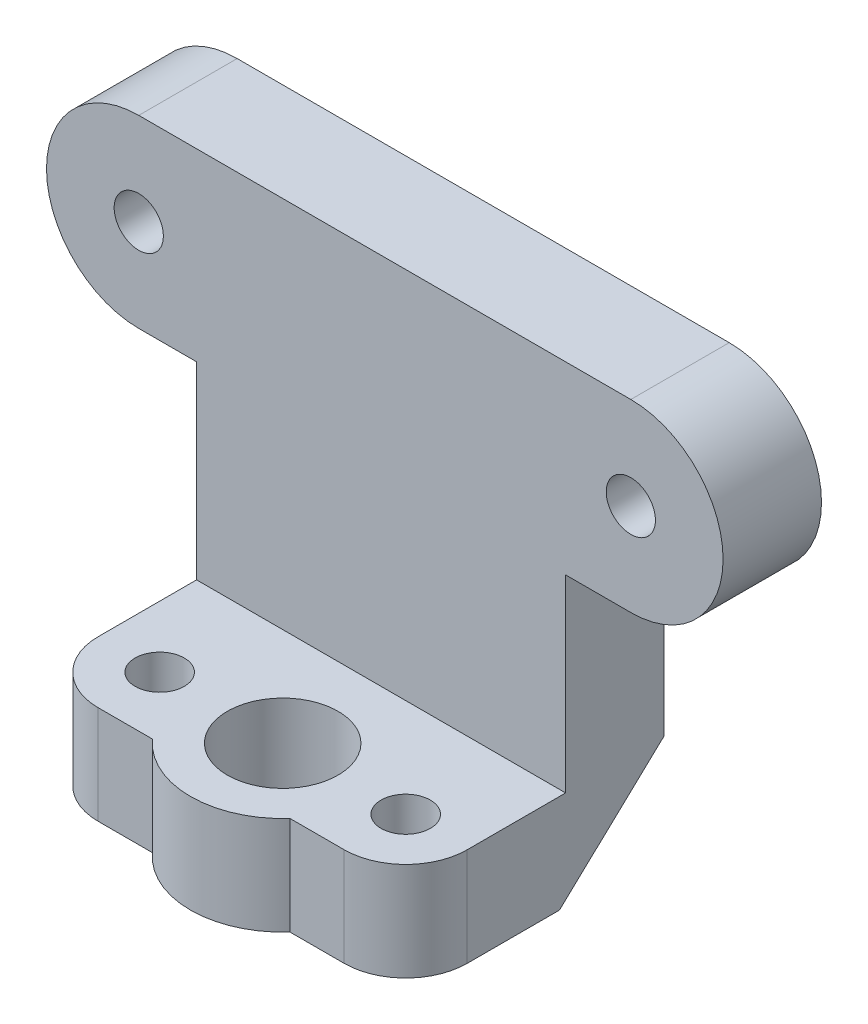
ISO-10303-21;
HEADER;
FILE_DESCRIPTION(('STEP AP214'),'2;1');
FILE_NAME('part.step','',(''),(''),'','','');
FILE_SCHEMA(('AUTOMOTIVE_DESIGN { 1 0 10303 214 1 1 1 1 }'));
ENDSEC;
DATA;
#1=APPLICATION_CONTEXT('core data for automotive mechanical design processes');
#2=APPLICATION_PROTOCOL_DEFINITION('international standard','automotive_design',2000,#1);
#3=PRODUCT_CONTEXT('',#1,'mechanical');
#4=PRODUCT('Part','Part','',(#3));
#5=PRODUCT_RELATED_PRODUCT_CATEGORY('part','',(#4));
#6=PRODUCT_DEFINITION_FORMATION('','',#4);
#7=PRODUCT_DEFINITION_CONTEXT('part definition',#1,'design');
#8=PRODUCT_DEFINITION('design','',#6,#7);
#9=PRODUCT_DEFINITION_SHAPE('','',#8);
#10=(LENGTH_UNIT() NAMED_UNIT(*) SI_UNIT(.MILLI.,.METRE.));
#11=(NAMED_UNIT(*) PLANE_ANGLE_UNIT() SI_UNIT($,.RADIAN.));
#12=(NAMED_UNIT(*) SI_UNIT($,.STERADIAN.) SOLID_ANGLE_UNIT());
#13=UNCERTAINTY_MEASURE_WITH_UNIT(LENGTH_MEASURE(1.E-05),#10,'distance_accuracy_value','');
#14=(GEOMETRIC_REPRESENTATION_CONTEXT(3) GLOBAL_UNCERTAINTY_ASSIGNED_CONTEXT((#13)) GLOBAL_UNIT_ASSIGNED_CONTEXT((#10,
#11,#12)) REPRESENTATION_CONTEXT('',''));
#15=CARTESIAN_POINT('',(0.,0.,0.));
#16=DIRECTION('',(0.,0.,1.));
#17=DIRECTION('',(1.,0.,0.));
#18=AXIS2_PLACEMENT_3D('',#15,#16,#17);
#19=CARTESIAN_POINT('',(144.2,-50.2500000000001,16.));
#20=DIRECTION('',(0.,1.,0.));
#21=DIRECTION('',(0.,0.,1.));
#22=AXIS2_PLACEMENT_3D('',#19,#20,#21);
#23=CYLINDRICAL_SURFACE('',#22,5.);
#24=CARTESIAN_POINT('',(144.2,-42.2500000000001,16.));
#25=DIRECTION('',(0.,1.,0.));
#26=DIRECTION('',(0.,0.,1.));
#27=AXIS2_PLACEMENT_3D('',#24,#25,#26);
#28=CIRCLE('',#27,5.);
#29=CARTESIAN_POINT('',(139.2,-42.2500000000001,16.));
#30=VERTEX_POINT('',#29);
#31=CARTESIAN_POINT('',(144.2,-42.2500000000001,21.));
#32=VERTEX_POINT('',#31);
#33=EDGE_CURVE('E193',#30,#32,#28,.T.);
#34=ORIENTED_EDGE('',*,*,#33,.F.);
#35=DIRECTION('',(0.,1.,0.));
#36=VECTOR('',#35,1.);
#37=CARTESIAN_POINT('',(139.2,-50.2500000000001,16.));
#38=LINE('',#37,#36);
#39=CARTESIAN_POINT('',(139.2,-50.2500000000001,16.));
#40=VERTEX_POINT('',#39);
#41=EDGE_CURVE('E170',#40,#30,#38,.T.);
#42=ORIENTED_EDGE('',*,*,#41,.F.);
#43=CARTESIAN_POINT('',(144.2,-50.2500000000001,16.));
#44=DIRECTION('',(0.,1.,0.));
#45=DIRECTION('',(0.,0.,1.));
#46=AXIS2_PLACEMENT_3D('',#43,#44,#45);
#47=CIRCLE('',#46,5.);
#48=CARTESIAN_POINT('',(144.2,-50.2500000000001,21.));
#49=VERTEX_POINT('',#48);
#50=EDGE_CURVE('E196',#40,#49,#47,.T.);
#51=ORIENTED_EDGE('',*,*,#50,.T.);
#52=DIRECTION('',(0.,1.,0.));
#53=VECTOR('',#52,1.);
#54=CARTESIAN_POINT('',(144.2,-50.2500000000001,21.));
#55=LINE('',#54,#53);
#56=EDGE_CURVE('E200',#49,#32,#55,.T.);
#57=ORIENTED_EDGE('',*,*,#56,.T.);
#58=EDGE_LOOP('',(#34,#42,#51,#57));
#59=FACE_BOUND('',#58,.T.);
#60=ADVANCED_FACE('F35',(#59),#23,.T.);
#61=CARTESIAN_POINT('',(154.2,-50.2500000000001,16.));
#62=DIRECTION('',(0.,1.,0.));
#63=DIRECTION('',(0.,0.,1.));
#64=AXIS2_PLACEMENT_3D('',#61,#62,#63);
#65=CYLINDRICAL_SURFACE('',#64,7.50000000000001);
#66=DIRECTION('',(0.,1.,0.));
#67=VECTOR('',#66,1.);
#68=CARTESIAN_POINT('',(159.790169943749,-50.2500000000001,21.));
#69=LINE('',#68,#67);
#70=CARTESIAN_POINT('',(159.790169943749,-50.2500000000001,21.));
#71=VERTEX_POINT('',#70);
#72=CARTESIAN_POINT('',(159.790169943749,-42.2500000000001,21.));
#73=VERTEX_POINT('',#72);
#74=EDGE_CURVE('E174',#71,#73,#69,.T.);
#75=ORIENTED_EDGE('',*,*,#74,.T.);
#76=CARTESIAN_POINT('',(154.2,-42.2500000000001,16.));
#77=DIRECTION('',(0.,1.,0.));
#78=DIRECTION('',(0.,0.,1.));
#79=AXIS2_PLACEMENT_3D('',#76,#77,#78);
#80=CIRCLE('',#79,7.50000000000001);
#81=CARTESIAN_POINT('',(148.609830056251,-42.2500000000001,21.));
#82=VERTEX_POINT('',#81);
#83=EDGE_CURVE('E44',#82,#73,#80,.T.);
#84=ORIENTED_EDGE('',*,*,#83,.F.);
#85=DIRECTION('',(0.,1.,0.));
#86=VECTOR('',#85,1.);
#87=CARTESIAN_POINT('',(148.60983005625,-50.2500000000001,21.));
#88=LINE('',#87,#86);
#89=CARTESIAN_POINT('',(148.60983005625,-50.2500000000001,21.));
#90=VERTEX_POINT('',#89);
#91=EDGE_CURVE('E203',#90,#82,#88,.T.);
#92=ORIENTED_EDGE('',*,*,#91,.F.);
#93=CARTESIAN_POINT('',(154.2,-50.2500000000001,16.));
#94=DIRECTION('',(0.,1.,0.));
#95=DIRECTION('',(0.,0.,1.));
#96=AXIS2_PLACEMENT_3D('',#93,#94,#95);
#97=CIRCLE('',#96,7.50000000000001);
#98=EDGE_CURVE('E11',#90,#71,#97,.T.);
#99=ORIENTED_EDGE('',*,*,#98,.T.);
#100=EDGE_LOOP('',(#75,#84,#92,#99));
#101=FACE_BOUND('',#100,.T.);
#102=ADVANCED_FACE('F37',(#101),#65,.T.);
#103=CARTESIAN_POINT('',(154.2,-50.2500000000001,16.));
#104=DIRECTION('',(0.,1.,0.));
#105=DIRECTION('',(0.,0.,1.));
#106=AXIS2_PLACEMENT_3D('',#103,#104,#105);
#107=PLANE('',#106);
#108=ORIENTED_EDGE('',*,*,#50,.F.);
#109=DIRECTION('',(0.,0.,1.));
#110=VECTOR('',#109,1.);
#111=CARTESIAN_POINT('',(139.2,-50.2500000000001,0.));
#112=LINE('',#111,#110);
#113=CARTESIAN_POINT('',(139.2,-50.2500000000001,8.49999999999997));
#114=VERTEX_POINT('',#113);
#115=EDGE_CURVE('E228',#114,#40,#112,.T.);
#116=ORIENTED_EDGE('',*,*,#115,.F.);
#117=DIRECTION('',(1.,0.,0.));
#118=VECTOR('',#117,1.);
#119=CARTESIAN_POINT('',(125.598529491265,-50.2500000000001,8.49999999999997));
#120=LINE('',#119,#118);
#121=CARTESIAN_POINT('',(169.2,-50.2500000000001,8.49999999999997));
#122=VERTEX_POINT('',#121);
#123=EDGE_CURVE('E155',#114,#122,#120,.T.);
#124=ORIENTED_EDGE('',*,*,#123,.T.);
#125=DIRECTION('',(0.,0.,-1.));
#126=VECTOR('',#125,1.);
#127=CARTESIAN_POINT('',(169.2,-50.2500000000001,0.));
#128=LINE('',#127,#126);
#129=CARTESIAN_POINT('',(169.2,-50.2500000000001,16.));
#130=VERTEX_POINT('',#129);
#131=EDGE_CURVE('E144',#130,#122,#128,.T.);
#132=ORIENTED_EDGE('',*,*,#131,.F.);
#133=CARTESIAN_POINT('',(164.2,-50.2500000000001,16.));
#134=DIRECTION('',(0.,1.,0.));
#135=DIRECTION('',(0.,0.,-1.));
#136=AXIS2_PLACEMENT_3D('',#133,#134,#135);
#137=CIRCLE('',#136,5.);
#138=CARTESIAN_POINT('',(164.2,-50.2500000000001,21.));
#139=VERTEX_POINT('',#138);
#140=EDGE_CURVE('E151',#139,#130,#137,.T.);
#141=ORIENTED_EDGE('',*,*,#140,.F.);
#142=DIRECTION('',(1.,0.,0.));
#143=VECTOR('',#142,1.);
#144=CARTESIAN_POINT('',(164.2,-50.2500000000001,21.));
#145=LINE('',#144,#143);
#146=EDGE_CURVE('E175',#71,#139,#145,.T.);
#147=ORIENTED_EDGE('',*,*,#146,.F.);
#148=ORIENTED_EDGE('',*,*,#98,.F.);
#149=DIRECTION('',(1.,0.,0.));
#150=VECTOR('',#149,1.);
#151=CARTESIAN_POINT('',(144.2,-50.2500000000001,21.));
#152=LINE('',#151,#150);
#153=EDGE_CURVE('E198',#49,#90,#152,.T.);
#154=ORIENTED_EDGE('',*,*,#153,.F.);
#155=EDGE_LOOP('',(#108,#116,#124,#132,#141,#147,#148,#154));
#156=FACE_BOUND('',#155,.T.);
#157=CARTESIAN_POINT('',(154.2,-50.2500000000001,16.));
#158=DIRECTION('',(0.,1.,0.));
#159=DIRECTION('',(0.,0.,1.));
#160=AXIS2_PLACEMENT_3D('',#157,#158,#159);
#161=CIRCLE('',#160,4.50000000000002);
#162=CARTESIAN_POINT('',(154.2,-50.2500000000001,20.5));
#163=VERTEX_POINT('',#162);
#164=EDGE_CURVE('E208',#163,#163,#161,.T.);
#165=ORIENTED_EDGE('',*,*,#164,.T.);
#166=EDGE_LOOP('',(#165));
#167=FACE_BOUND('',#166,.T.);
#168=CARTESIAN_POINT('',(144.2,-50.2500000000001,16.));
#169=DIRECTION('',(0.,1.,0.));
#170=DIRECTION('',(0.,0.,1.));
#171=AXIS2_PLACEMENT_3D('',#168,#169,#170);
#172=CIRCLE('',#171,2.);
#173=CARTESIAN_POINT('',(144.2,-50.2500000000001,18.));
#174=VERTEX_POINT('',#173);
#175=EDGE_CURVE('E190',#174,#174,#172,.T.);
#176=ORIENTED_EDGE('',*,*,#175,.T.);
#177=EDGE_LOOP('',(#176));
#178=FACE_BOUND('',#177,.T.);
#179=CARTESIAN_POINT('',(164.2,-50.2500000000001,16.));
#180=DIRECTION('',(0.,1.,0.));
#181=DIRECTION('',(0.,0.,-1.));
#182=AXIS2_PLACEMENT_3D('',#179,#180,#181);
#183=CIRCLE('',#182,2.);
#184=CARTESIAN_POINT('',(164.2,-50.2500000000001,14.));
#185=VERTEX_POINT('',#184);
#186=EDGE_CURVE('E186',#185,#185,#183,.T.);
#187=ORIENTED_EDGE('',*,*,#186,.T.);
#188=EDGE_LOOP('',(#187));
#189=FACE_BOUND('',#188,.T.);
#190=ADVANCED_FACE('F147',(#156,#167,#178,#189),#107,.F.);
#191=CARTESIAN_POINT('',(154.2,-42.2500000000001,16.));
#192=DIRECTION('',(0.,1.,0.));
#193=DIRECTION('',(0.,0.,1.));
#194=AXIS2_PLACEMENT_3D('',#191,#192,#193);
#195=PLANE('',#194);
#196=DIRECTION('',(0.,0.,1.));
#197=VECTOR('',#196,1.);
#198=CARTESIAN_POINT('',(139.2,-42.2500000000001,0.));
#199=LINE('',#198,#197);
#200=CARTESIAN_POINT('',(139.2,-42.2500000000001,7.99999999999999));
#201=VERTEX_POINT('',#200);
#202=EDGE_CURVE('E216',#201,#30,#199,.T.);
#203=ORIENTED_EDGE('',*,*,#202,.T.);
#204=ORIENTED_EDGE('',*,*,#33,.T.);
#205=DIRECTION('',(1.,0.,0.));
#206=VECTOR('',#205,1.);
#207=CARTESIAN_POINT('',(144.2,-42.2500000000001,21.));
#208=LINE('',#207,#206);
#209=EDGE_CURVE('E59',#32,#82,#208,.T.);
#210=ORIENTED_EDGE('',*,*,#209,.T.);
#211=ORIENTED_EDGE('',*,*,#83,.T.);
#212=DIRECTION('',(1.,0.,0.));
#213=VECTOR('',#212,1.);
#214=CARTESIAN_POINT('',(164.2,-42.2500000000001,21.));
#215=LINE('',#214,#213);
#216=CARTESIAN_POINT('',(164.2,-42.2500000000001,21.));
#217=VERTEX_POINT('',#216);
#218=EDGE_CURVE('E183',#73,#217,#215,.T.);
#219=ORIENTED_EDGE('',*,*,#218,.T.);
#220=CARTESIAN_POINT('',(164.2,-42.2500000000001,16.));
#221=DIRECTION('',(0.,1.,0.));
#222=DIRECTION('',(0.,0.,-1.));
#223=AXIS2_PLACEMENT_3D('',#220,#221,#222);
#224=CIRCLE('',#223,5.);
#225=CARTESIAN_POINT('',(169.2,-42.2500000000001,16.));
#226=VERTEX_POINT('',#225);
#227=EDGE_CURVE('E179',#217,#226,#224,.T.);
#228=ORIENTED_EDGE('',*,*,#227,.T.);
#229=DIRECTION('',(0.,0.,-1.));
#230=VECTOR('',#229,1.);
#231=CARTESIAN_POINT('',(169.2,-42.2500000000001,0.));
#232=LINE('',#231,#230);
#233=CARTESIAN_POINT('',(169.2,-42.2500000000001,8.));
#234=VERTEX_POINT('',#233);
#235=EDGE_CURVE('E166',#226,#234,#232,.T.);
#236=ORIENTED_EDGE('',*,*,#235,.T.);
#237=DIRECTION('',(1.,0.,0.));
#238=VECTOR('',#237,1.);
#239=CARTESIAN_POINT('',(139.2,-42.2500000000001,7.99999999999999));
#240=LINE('',#239,#238);
#241=EDGE_CURVE('E52',#201,#234,#240,.T.);
#242=ORIENTED_EDGE('',*,*,#241,.F.);
#243=EDGE_LOOP('',(#203,#204,#210,#211,#219,#228,#236,#242));
#244=FACE_BOUND('',#243,.T.);
#245=CARTESIAN_POINT('',(154.2,-42.2500000000001,16.));
#246=DIRECTION('',(0.,1.,0.));
#247=DIRECTION('',(0.,0.,1.));
#248=AXIS2_PLACEMENT_3D('',#245,#246,#247);
#249=CIRCLE('',#248,4.50000000000002);
#250=CARTESIAN_POINT('',(154.2,-42.2500000000001,20.5));
#251=VERTEX_POINT('',#250);
#252=EDGE_CURVE('E205',#251,#251,#249,.T.);
#253=ORIENTED_EDGE('',*,*,#252,.F.);
#254=EDGE_LOOP('',(#253));
#255=FACE_BOUND('',#254,.T.);
#256=CARTESIAN_POINT('',(144.2,-42.2500000000001,16.));
#257=DIRECTION('',(0.,1.,0.));
#258=DIRECTION('',(0.,0.,1.));
#259=AXIS2_PLACEMENT_3D('',#256,#257,#258);
#260=CIRCLE('',#259,2.);
#261=CARTESIAN_POINT('',(144.2,-42.2500000000001,18.));
#262=VERTEX_POINT('',#261);
#263=EDGE_CURVE('E188',#262,#262,#260,.T.);
#264=ORIENTED_EDGE('',*,*,#263,.F.);
#265=EDGE_LOOP('',(#264));
#266=FACE_BOUND('',#265,.T.);
#267=CARTESIAN_POINT('',(164.2,-42.2500000000001,16.));
#268=DIRECTION('',(0.,1.,0.));
#269=DIRECTION('',(0.,0.,-1.));
#270=AXIS2_PLACEMENT_3D('',#267,#268,#269);
#271=CIRCLE('',#270,2.);
#272=CARTESIAN_POINT('',(164.2,-42.2500000000001,14.));
#273=VERTEX_POINT('',#272);
#274=EDGE_CURVE('E227',#273,#273,#271,.T.);
#275=ORIENTED_EDGE('',*,*,#274,.F.);
#276=EDGE_LOOP('',(#275));
#277=FACE_BOUND('',#276,.T.);
#278=ADVANCED_FACE('F235',(#244,#255,#266,#277),#195,.T.);
#279=CARTESIAN_POINT('',(154.2,-50.2500000000001,16.));
#280=DIRECTION('',(0.,1.,0.));
#281=DIRECTION('',(0.,0.,1.));
#282=AXIS2_PLACEMENT_3D('',#279,#280,#281);
#283=CYLINDRICAL_SURFACE('',#282,4.50000000000002);
#284=ORIENTED_EDGE('',*,*,#164,.F.);
#285=EDGE_LOOP('',(#284));
#286=FACE_BOUND('',#285,.T.);
#287=ORIENTED_EDGE('',*,*,#252,.T.);
#288=EDGE_LOOP('',(#287));
#289=FACE_BOUND('',#288,.T.);
#290=ADVANCED_FACE('F237',(#286,#289),#283,.F.);
#291=CARTESIAN_POINT('',(144.2,-50.2500000000001,21.));
#292=DIRECTION('',(0.,0.,1.));
#293=DIRECTION('',(1.,0.,0.));
#294=AXIS2_PLACEMENT_3D('',#291,#292,#293);
#295=PLANE('',#294);
#296=ORIENTED_EDGE('',*,*,#209,.F.);
#297=ORIENTED_EDGE('',*,*,#56,.F.);
#298=ORIENTED_EDGE('',*,*,#153,.T.);
#299=ORIENTED_EDGE('',*,*,#91,.T.);
#300=EDGE_LOOP('',(#296,#297,#298,#299));
#301=FACE_BOUND('',#300,.T.);
#302=ADVANCED_FACE('F242',(#301),#295,.T.);
#303=CARTESIAN_POINT('',(144.2,-50.2500000000001,16.));
#304=DIRECTION('',(0.,1.,0.));
#305=DIRECTION('',(0.,0.,1.));
#306=AXIS2_PLACEMENT_3D('',#303,#304,#305);
#307=CYLINDRICAL_SURFACE('',#306,2.);
#308=ORIENTED_EDGE('',*,*,#175,.F.);
#309=EDGE_LOOP('',(#308));
#310=FACE_BOUND('',#309,.T.);
#311=ORIENTED_EDGE('',*,*,#263,.T.);
#312=EDGE_LOOP('',(#311));
#313=FACE_BOUND('',#312,.T.);
#314=ADVANCED_FACE('F258',(#310,#313),#307,.F.);
#315=CARTESIAN_POINT('',(164.2,-50.2500000000001,16.));
#316=DIRECTION('',(0.,1.,0.));
#317=DIRECTION('',(0.,0.,1.));
#318=AXIS2_PLACEMENT_3D('',#315,#316,#317);
#319=CYLINDRICAL_SURFACE('',#318,5.);
#320=DIRECTION('',(0.,1.,0.));
#321=VECTOR('',#320,1.);
#322=CARTESIAN_POINT('',(169.2,-50.2500000000001,16.));
#323=LINE('',#322,#321);
#324=EDGE_CURVE('E163',#130,#226,#323,.T.);
#325=ORIENTED_EDGE('',*,*,#324,.T.);
#326=ORIENTED_EDGE('',*,*,#227,.F.);
#327=DIRECTION('',(0.,1.,0.));
#328=VECTOR('',#327,1.);
#329=CARTESIAN_POINT('',(164.2,-50.2500000000001,21.));
#330=LINE('',#329,#328);
#331=EDGE_CURVE('E173',#139,#217,#330,.T.);
#332=ORIENTED_EDGE('',*,*,#331,.F.);
#333=ORIENTED_EDGE('',*,*,#140,.T.);
#334=EDGE_LOOP('',(#325,#326,#332,#333));
#335=FACE_BOUND('',#334,.T.);
#336=ADVANCED_FACE('F172',(#335),#319,.T.);
#337=CARTESIAN_POINT('',(164.2,-50.2500000000001,21.));
#338=DIRECTION('',(0.,0.,1.));
#339=DIRECTION('',(1.,0.,0.));
#340=AXIS2_PLACEMENT_3D('',#337,#338,#339);
#341=PLANE('',#340);
#342=ORIENTED_EDGE('',*,*,#218,.F.);
#343=ORIENTED_EDGE('',*,*,#74,.F.);
#344=ORIENTED_EDGE('',*,*,#146,.T.);
#345=ORIENTED_EDGE('',*,*,#331,.T.);
#346=EDGE_LOOP('',(#342,#343,#344,#345));
#347=FACE_BOUND('',#346,.T.);
#348=ADVANCED_FACE('F263',(#347),#341,.T.);
#349=CARTESIAN_POINT('',(164.2,-50.2500000000001,16.));
#350=DIRECTION('',(0.,1.,0.));
#351=DIRECTION('',(0.,0.,1.));
#352=AXIS2_PLACEMENT_3D('',#349,#350,#351);
#353=CYLINDRICAL_SURFACE('',#352,2.);
#354=ORIENTED_EDGE('',*,*,#186,.F.);
#355=EDGE_LOOP('',(#354));
#356=FACE_BOUND('',#355,.T.);
#357=ORIENTED_EDGE('',*,*,#274,.T.);
#358=EDGE_LOOP('',(#357));
#359=FACE_BOUND('',#358,.T.);
#360=ADVANCED_FACE('F233',(#356,#359),#353,.F.);
#361=CARTESIAN_POINT('',(125.598529491265,-22.404128440367,-21.0862385321102));
#362=DIRECTION('',(0.,-0.728199992692802,-0.685364699004992));
#363=DIRECTION('',(0.,0.685364699004992,-0.728199992692802));
#364=AXIS2_PLACEMENT_3D('',#361,#362,#363);
#365=PLANE('',#364);
#366=DIRECTION('',(0.,-0.685364699004992,0.728199992692802));
#367=VECTOR('',#366,1.);
#368=CARTESIAN_POINT('',(139.2,-22.404128440367,-21.0862385321102));
#369=LINE('',#368,#367);
#370=CARTESIAN_POINT('',(139.2,-42.2500000000001,0.));
#371=VERTEX_POINT('',#370);
#372=EDGE_CURVE('E225',#371,#114,#369,.T.);
#373=ORIENTED_EDGE('',*,*,#372,.F.);
#374=DIRECTION('',(1.,0.,0.));
#375=VECTOR('',#374,1.);
#376=CARTESIAN_POINT('',(125.598529491265,-42.2500000000001,0.));
#377=LINE('',#376,#375);
#378=CARTESIAN_POINT('',(169.2,-42.2500000000001,0.));
#379=VERTEX_POINT('',#378);
#380=EDGE_CURVE('E222',#371,#379,#377,.T.);
#381=ORIENTED_EDGE('',*,*,#380,.T.);
#382=DIRECTION('',(0.,0.685364699004992,-0.728199992692802));
#383=VECTOR('',#382,1.);
#384=CARTESIAN_POINT('',(169.2,-22.404128440367,-21.0862385321102));
#385=LINE('',#384,#383);
#386=EDGE_CURVE('E159',#122,#379,#385,.T.);
#387=ORIENTED_EDGE('',*,*,#386,.F.);
#388=ORIENTED_EDGE('',*,*,#123,.F.);
#389=EDGE_LOOP('',(#373,#381,#387,#388));
#390=FACE_BOUND('',#389,.T.);
#391=ADVANCED_FACE('F271',(#390),#365,.T.);
#392=CARTESIAN_POINT('',(169.2,0.,0.));
#393=DIRECTION('',(1.,0.,0.));
#394=DIRECTION('',(0.,0.,-1.));
#395=AXIS2_PLACEMENT_3D('',#392,#393,#394);
#396=PLANE('',#395);
#397=ORIENTED_EDGE('',*,*,#131,.T.);
#398=ORIENTED_EDGE('',*,*,#386,.T.);
#399=DIRECTION('',(0.,1.,0.));
#400=VECTOR('',#399,1.);
#401=CARTESIAN_POINT('',(169.2,-73.2983493925202,0.));
#402=LINE('',#401,#400);
#403=CARTESIAN_POINT('',(169.2,-26.9000000000001,0.));
#404=VERTEX_POINT('',#403);
#405=EDGE_CURVE('E382',#379,#404,#402,.T.);
#406=ORIENTED_EDGE('',*,*,#405,.T.);
#407=DIRECTION('',(0.,0.,1.));
#408=VECTOR('',#407,1.);
#409=CARTESIAN_POINT('',(169.2,-26.9000000000001,8.));
#410=LINE('',#409,#408);
#411=CARTESIAN_POINT('',(169.2,-26.9000000000001,8.));
#412=VERTEX_POINT('',#411);
#413=EDGE_CURVE('E392',#404,#412,#410,.T.);
#414=ORIENTED_EDGE('',*,*,#413,.T.);
#415=DIRECTION('',(0.,1.,0.));
#416=VECTOR('',#415,1.);
#417=CARTESIAN_POINT('',(169.2,-73.2983493925202,8.));
#418=LINE('',#417,#416);
#419=EDGE_CURVE('E389',#234,#412,#418,.T.);
#420=ORIENTED_EDGE('',*,*,#419,.F.);
#421=ORIENTED_EDGE('',*,*,#235,.F.);
#422=ORIENTED_EDGE('',*,*,#324,.F.);
#423=EDGE_LOOP('',(#397,#398,#406,#414,#420,#421,#422));
#424=FACE_BOUND('',#423,.T.);
#425=ADVANCED_FACE('F164',(#424),#396,.T.);
#426=CARTESIAN_POINT('',(139.2,-73.2983493925202,0.));
#427=DIRECTION('',(1.,0.,0.));
#428=DIRECTION('',(0.,0.,-1.));
#429=AXIS2_PLACEMENT_3D('',#426,#427,#428);
#430=PLANE('',#429);
#431=ORIENTED_EDGE('',*,*,#115,.T.);
#432=ORIENTED_EDGE('',*,*,#41,.T.);
#433=ORIENTED_EDGE('',*,*,#202,.F.);
#434=DIRECTION('',(0.,1.,0.));
#435=VECTOR('',#434,1.);
#436=CARTESIAN_POINT('',(139.2,-73.2983493925202,7.99999999999999));
#437=LINE('',#436,#435);
#438=CARTESIAN_POINT('',(139.2,-26.9000000000001,7.99999999999999));
#439=VERTEX_POINT('',#438);
#440=EDGE_CURVE('E327',#201,#439,#437,.T.);
#441=ORIENTED_EDGE('',*,*,#440,.T.);
#442=DIRECTION('',(0.,0.,-1.));
#443=VECTOR('',#442,1.);
#444=CARTESIAN_POINT('',(139.2,-26.9000000000001,0.));
#445=LINE('',#444,#443);
#446=CARTESIAN_POINT('',(139.2,-26.9000000000001,0.));
#447=VERTEX_POINT('',#446);
#448=EDGE_CURVE('E372',#439,#447,#445,.T.);
#449=ORIENTED_EDGE('',*,*,#448,.T.);
#450=DIRECTION('',(0.,1.,0.));
#451=VECTOR('',#450,1.);
#452=CARTESIAN_POINT('',(139.2,-73.2983493925202,0.));
#453=LINE('',#452,#451);
#454=EDGE_CURVE('E388',#371,#447,#453,.T.);
#455=ORIENTED_EDGE('',*,*,#454,.F.);
#456=ORIENTED_EDGE('',*,*,#372,.T.);
#457=EDGE_LOOP('',(#431,#432,#433,#441,#449,#455,#456));
#458=FACE_BOUND('',#457,.T.);
#459=ADVANCED_FACE('F278',(#458),#430,.F.);
#460=CARTESIAN_POINT('',(174.5,-26.9000000000001,8.));
#461=DIRECTION('',(0.,1.,0.));
#462=DIRECTION('',(0.,0.,1.));
#463=AXIS2_PLACEMENT_3D('',#460,#461,#462);
#464=PLANE('',#463);
#465=ORIENTED_EDGE('',*,*,#413,.F.);
#466=DIRECTION('',(1.,0.,0.));
#467=VECTOR('',#466,1.);
#468=CARTESIAN_POINT('',(174.5,-26.9000000000001,0.));
#469=LINE('',#468,#467);
#470=CARTESIAN_POINT('',(174.5,-26.9000000000001,0.));
#471=VERTEX_POINT('',#470);
#472=EDGE_CURVE('E351',#404,#471,#469,.T.);
#473=ORIENTED_EDGE('',*,*,#472,.T.);
#474=DIRECTION('',(0.,0.,-1.));
#475=VECTOR('',#474,1.);
#476=CARTESIAN_POINT('',(174.5,-26.9000000000001,8.));
#477=LINE('',#476,#475);
#478=CARTESIAN_POINT('',(174.5,-26.9000000000001,8.));
#479=VERTEX_POINT('',#478);
#480=EDGE_CURVE('E363',#479,#471,#477,.T.);
#481=ORIENTED_EDGE('',*,*,#480,.F.);
#482=DIRECTION('',(1.,0.,0.));
#483=VECTOR('',#482,1.);
#484=CARTESIAN_POINT('',(174.5,-26.9000000000001,8.));
#485=LINE('',#484,#483);
#486=EDGE_CURVE('E339',#412,#479,#485,.T.);
#487=ORIENTED_EDGE('',*,*,#486,.F.);
#488=EDGE_LOOP('',(#465,#473,#481,#487));
#489=FACE_BOUND('',#488,.T.);
#490=ADVANCED_FACE('F281',(#489),#464,.F.);
#491=ORIENTED_EDGE('',*,*,#448,.F.);
#492=CARTESIAN_POINT('',(134.5,-26.9000000000001,8.));
#493=VERTEX_POINT('',#492);
#494=EDGE_CURVE('E341',#493,#439,#485,.T.);
#495=ORIENTED_EDGE('',*,*,#494,.F.);
#496=DIRECTION('',(0.,0.,-1.));
#497=VECTOR('',#496,1.);
#498=CARTESIAN_POINT('',(134.5,-26.9000000000001,8.));
#499=LINE('',#498,#497);
#500=CARTESIAN_POINT('',(134.5,-26.9000000000001,0.));
#501=VERTEX_POINT('',#500);
#502=EDGE_CURVE('E160',#493,#501,#499,.T.);
#503=ORIENTED_EDGE('',*,*,#502,.T.);
#504=EDGE_CURVE('E352',#501,#447,#469,.T.);
#505=ORIENTED_EDGE('',*,*,#504,.T.);
#506=EDGE_LOOP('',(#491,#495,#503,#505));
#507=FACE_BOUND('',#506,.T.);
#508=ADVANCED_FACE('F291',(#507),#464,.F.);
#509=CARTESIAN_POINT('',(134.5,-19.4000000000001,8.));
#510=DIRECTION('',(0.,0.,1.));
#511=DIRECTION('',(1.,0.,0.));
#512=AXIS2_PLACEMENT_3D('',#509,#510,#511);
#513=PLANE('',#512);
#514=CARTESIAN_POINT('',(134.5,-19.4000000000001,8.));
#515=DIRECTION('',(0.,0.,1.));
#516=DIRECTION('',(1.,0.,0.));
#517=AXIS2_PLACEMENT_3D('',#514,#515,#516);
#518=CIRCLE('',#517,2.);
#519=CARTESIAN_POINT('',(136.5,-19.4000000000001,8.));
#520=VERTEX_POINT('',#519);
#521=EDGE_CURVE('E330',#520,#520,#518,.T.);
#522=ORIENTED_EDGE('',*,*,#521,.F.);
#523=EDGE_LOOP('',(#522));
#524=FACE_BOUND('',#523,.T.);
#525=CARTESIAN_POINT('',(134.5,-19.4000000000001,8.));
#526=DIRECTION('',(0.,0.,1.));
#527=DIRECTION('',(1.,0.,0.));
#528=AXIS2_PLACEMENT_3D('',#525,#526,#527);
#529=CIRCLE('',#528,7.5);
#530=CARTESIAN_POINT('',(134.5,-11.9000000000001,8.));
#531=VERTEX_POINT('',#530);
#532=EDGE_CURVE('E336',#531,#493,#529,.T.);
#533=ORIENTED_EDGE('',*,*,#532,.T.);
#534=ORIENTED_EDGE('',*,*,#494,.T.);
#535=ORIENTED_EDGE('',*,*,#440,.F.);
#536=ORIENTED_EDGE('',*,*,#241,.T.);
#537=ORIENTED_EDGE('',*,*,#419,.T.);
#538=ORIENTED_EDGE('',*,*,#486,.T.);
#539=CARTESIAN_POINT('',(174.5,-19.4000000000001,8.));
#540=DIRECTION('',(0.,0.,1.));
#541=DIRECTION('',(1.,0.,0.));
#542=AXIS2_PLACEMENT_3D('',#539,#540,#541);
#543=CIRCLE('',#542,7.5);
#544=CARTESIAN_POINT('',(174.5,-11.9000000000001,8.));
#545=VERTEX_POINT('',#544);
#546=EDGE_CURVE('E344',#479,#545,#543,.T.);
#547=ORIENTED_EDGE('',*,*,#546,.T.);
#548=DIRECTION('',(-1.,0.,0.));
#549=VECTOR('',#548,1.);
#550=CARTESIAN_POINT('',(134.5,-11.9000000000001,8.));
#551=LINE('',#550,#549);
#552=EDGE_CURVE('E346',#545,#531,#551,.T.);
#553=ORIENTED_EDGE('',*,*,#552,.T.);
#554=EDGE_LOOP('',(#533,#534,#535,#536,#537,#538,#547,#553));
#555=FACE_BOUND('',#554,.T.);
#556=CARTESIAN_POINT('',(174.5,-19.4000000000001,8.));
#557=DIRECTION('',(0.,0.,1.));
#558=DIRECTION('',(1.,0.,0.));
#559=AXIS2_PLACEMENT_3D('',#556,#557,#558);
#560=CIRCLE('',#559,2.);
#561=CARTESIAN_POINT('',(176.5,-19.4000000000001,8.));
#562=VERTEX_POINT('',#561);
#563=EDGE_CURVE('E319',#562,#562,#560,.T.);
#564=ORIENTED_EDGE('',*,*,#563,.F.);
#565=EDGE_LOOP('',(#564));
#566=FACE_BOUND('',#565,.T.);
#567=ADVANCED_FACE('F303',(#524,#555,#566),#513,.T.);
#568=CARTESIAN_POINT('',(134.5,-19.4000000000001,0.));
#569=DIRECTION('',(0.,0.,1.));
#570=DIRECTION('',(1.,0.,0.));
#571=AXIS2_PLACEMENT_3D('',#568,#569,#570);
#572=PLANE('',#571);
#573=CARTESIAN_POINT('',(134.5,-19.4000000000001,0.));
#574=DIRECTION('',(0.,0.,1.));
#575=DIRECTION('',(1.,0.,0.));
#576=AXIS2_PLACEMENT_3D('',#573,#574,#575);
#577=CIRCLE('',#576,7.5);
#578=CARTESIAN_POINT('',(134.5,-11.9000000000001,0.));
#579=VERTEX_POINT('',#578);
#580=EDGE_CURVE('E333',#579,#501,#577,.T.);
#581=ORIENTED_EDGE('',*,*,#580,.F.);
#582=DIRECTION('',(-1.,0.,0.));
#583=VECTOR('',#582,1.);
#584=CARTESIAN_POINT('',(134.5,-11.9000000000001,0.));
#585=LINE('',#584,#583);
#586=CARTESIAN_POINT('',(174.5,-11.9000000000001,0.));
#587=VERTEX_POINT('',#586);
#588=EDGE_CURVE('E340',#587,#579,#585,.T.);
#589=ORIENTED_EDGE('',*,*,#588,.F.);
#590=CARTESIAN_POINT('',(174.5,-19.4000000000001,0.));
#591=DIRECTION('',(0.,0.,1.));
#592=DIRECTION('',(1.,0.,0.));
#593=AXIS2_PLACEMENT_3D('',#590,#591,#592);
#594=CIRCLE('',#593,7.5);
#595=EDGE_CURVE('E355',#471,#587,#594,.T.);
#596=ORIENTED_EDGE('',*,*,#595,.F.);
#597=ORIENTED_EDGE('',*,*,#472,.F.);
#598=ORIENTED_EDGE('',*,*,#405,.F.);
#599=ORIENTED_EDGE('',*,*,#380,.F.);
#600=ORIENTED_EDGE('',*,*,#454,.T.);
#601=ORIENTED_EDGE('',*,*,#504,.F.);
#602=EDGE_LOOP('',(#581,#589,#596,#597,#598,#599,#600,#601));
#603=FACE_BOUND('',#602,.T.);
#604=CARTESIAN_POINT('',(134.5,-19.4000000000001,0.));
#605=DIRECTION('',(0.,0.,1.));
#606=DIRECTION('',(1.,0.,0.));
#607=AXIS2_PLACEMENT_3D('',#604,#605,#606);
#608=CIRCLE('',#607,2.);
#609=CARTESIAN_POINT('',(136.5,-19.4000000000001,0.));
#610=VERTEX_POINT('',#609);
#611=EDGE_CURVE('E325',#610,#610,#608,.T.);
#612=ORIENTED_EDGE('',*,*,#611,.T.);
#613=EDGE_LOOP('',(#612));
#614=FACE_BOUND('',#613,.T.);
#615=CARTESIAN_POINT('',(174.5,-19.4000000000001,0.));
#616=DIRECTION('',(0.,0.,1.));
#617=DIRECTION('',(1.,0.,0.));
#618=AXIS2_PLACEMENT_3D('',#615,#616,#617);
#619=CIRCLE('',#618,2.);
#620=CARTESIAN_POINT('',(176.5,-19.4000000000001,0.));
#621=VERTEX_POINT('',#620);
#622=EDGE_CURVE('E322',#621,#621,#619,.T.);
#623=ORIENTED_EDGE('',*,*,#622,.T.);
#624=EDGE_LOOP('',(#623));
#625=FACE_BOUND('',#624,.T.);
#626=ADVANCED_FACE('F287',(#603,#614,#625),#572,.F.);
#627=CARTESIAN_POINT('',(134.5,-19.4000000000001,8.));
#628=DIRECTION('',(0.,0.,-1.));
#629=DIRECTION('',(-1.,0.,0.));
#630=AXIS2_PLACEMENT_3D('',#627,#628,#629);
#631=CYLINDRICAL_SURFACE('',#630,7.5);
#632=ORIENTED_EDGE('',*,*,#580,.T.);
#633=ORIENTED_EDGE('',*,*,#502,.F.);
#634=ORIENTED_EDGE('',*,*,#532,.F.);
#635=DIRECTION('',(0.,0.,-1.));
#636=VECTOR('',#635,1.);
#637=CARTESIAN_POINT('',(134.5,-11.9000000000001,8.));
#638=LINE('',#637,#636);
#639=EDGE_CURVE('E348',#531,#579,#638,.T.);
#640=ORIENTED_EDGE('',*,*,#639,.T.);
#641=EDGE_LOOP('',(#632,#633,#634,#640));
#642=FACE_BOUND('',#641,.T.);
#643=ADVANCED_FACE('F283',(#642),#631,.T.);
#644=CARTESIAN_POINT('',(174.5,-19.4000000000001,8.));
#645=DIRECTION('',(0.,0.,-1.));
#646=DIRECTION('',(-1.,0.,0.));
#647=AXIS2_PLACEMENT_3D('',#644,#645,#646);
#648=CYLINDRICAL_SURFACE('',#647,7.5);
#649=ORIENTED_EDGE('',*,*,#595,.T.);
#650=DIRECTION('',(0.,0.,-1.));
#651=VECTOR('',#650,1.);
#652=CARTESIAN_POINT('',(174.5,-11.9000000000001,8.));
#653=LINE('',#652,#651);
#654=EDGE_CURVE('E360',#545,#587,#653,.T.);
#655=ORIENTED_EDGE('',*,*,#654,.F.);
#656=ORIENTED_EDGE('',*,*,#546,.F.);
#657=ORIENTED_EDGE('',*,*,#480,.T.);
#658=EDGE_LOOP('',(#649,#655,#656,#657));
#659=FACE_BOUND('',#658,.T.);
#660=ADVANCED_FACE('F286',(#659),#648,.T.);
#661=CARTESIAN_POINT('',(134.5,-11.9000000000001,8.));
#662=DIRECTION('',(0.,-1.,0.));
#663=DIRECTION('',(0.,0.,-1.));
#664=AXIS2_PLACEMENT_3D('',#661,#662,#663);
#665=PLANE('',#664);
#666=ORIENTED_EDGE('',*,*,#588,.T.);
#667=ORIENTED_EDGE('',*,*,#639,.F.);
#668=ORIENTED_EDGE('',*,*,#552,.F.);
#669=ORIENTED_EDGE('',*,*,#654,.T.);
#670=EDGE_LOOP('',(#666,#667,#668,#669));
#671=FACE_BOUND('',#670,.T.);
#672=ADVANCED_FACE('F295',(#671),#665,.F.);
#673=CARTESIAN_POINT('',(134.5,-19.4000000000001,8.));
#674=DIRECTION('',(0.,0.,-1.));
#675=DIRECTION('',(-1.,0.,0.));
#676=AXIS2_PLACEMENT_3D('',#673,#674,#675);
#677=CYLINDRICAL_SURFACE('',#676,2.);
#678=ORIENTED_EDGE('',*,*,#521,.T.);
#679=EDGE_LOOP('',(#678));
#680=FACE_BOUND('',#679,.T.);
#681=ORIENTED_EDGE('',*,*,#611,.F.);
#682=EDGE_LOOP('',(#681));
#683=FACE_BOUND('',#682,.T.);
#684=ADVANCED_FACE('F299',(#680,#683),#677,.F.);
#685=CARTESIAN_POINT('',(174.5,-19.4000000000001,8.));
#686=DIRECTION('',(0.,0.,-1.));
#687=DIRECTION('',(-1.,0.,0.));
#688=AXIS2_PLACEMENT_3D('',#685,#686,#687);
#689=CYLINDRICAL_SURFACE('',#688,2.);
#690=ORIENTED_EDGE('',*,*,#563,.T.);
#691=EDGE_LOOP('',(#690));
#692=FACE_BOUND('',#691,.T.);
#693=ORIENTED_EDGE('',*,*,#622,.F.);
#694=EDGE_LOOP('',(#693));
#695=FACE_BOUND('',#694,.T.);
#696=ADVANCED_FACE('F310',(#692,#695),#689,.F.);
#697=CLOSED_SHELL('',(#60,#102,#190,#278,#290,#302,#314,#336,#348,#360,#391,#425,#459,#490,#508,
#567,#626,#643,#660,#672,#684,#696));
#698=MANIFOLD_SOLID_BREP('B2',#697);
#699=ADVANCED_BREP_SHAPE_REPRESENTATION('',(#18,#698),#14);
#700=SHAPE_DEFINITION_REPRESENTATION(#9,#699);
ENDSEC;
END-ISO-10303-21;
